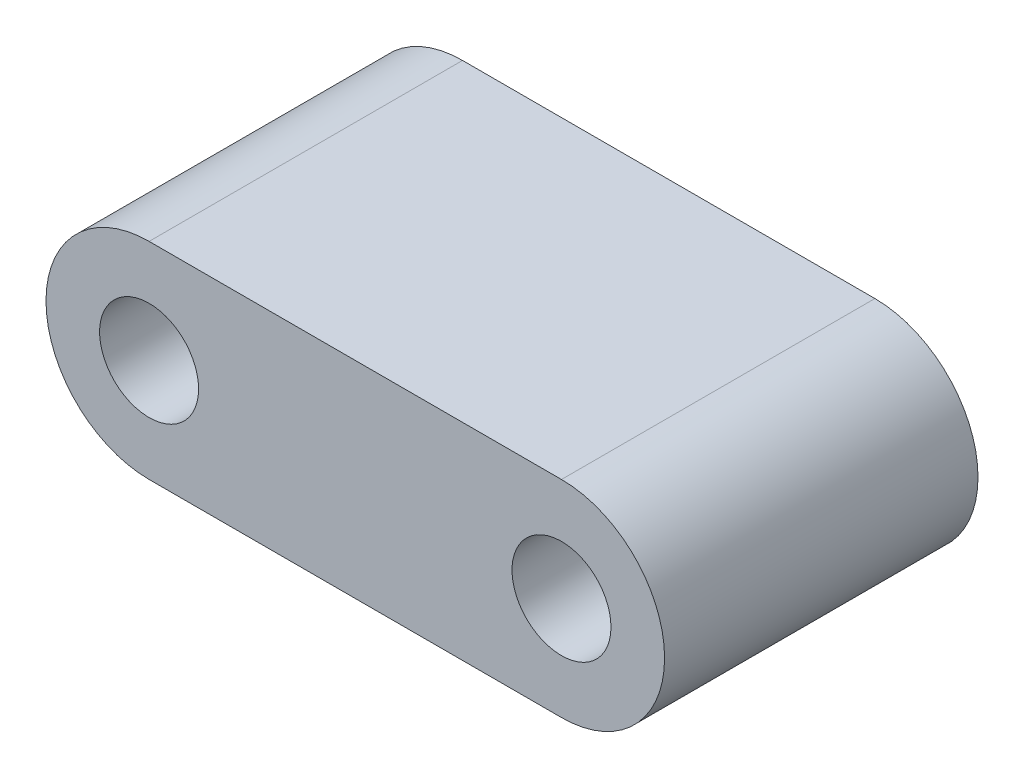
ISO-10303-21;
HEADER;
FILE_DESCRIPTION(('STEP AP214'),'2;1');
FILE_NAME('part.step','',(''),(''),'','','');
FILE_SCHEMA(('AUTOMOTIVE_DESIGN { 1 0 10303 214 1 1 1 1 }'));
ENDSEC;
DATA;
#1=APPLICATION_CONTEXT('core data for automotive mechanical design processes');
#2=APPLICATION_PROTOCOL_DEFINITION('international standard','automotive_design',2000,#1);
#3=PRODUCT_CONTEXT('',#1,'mechanical');
#4=PRODUCT('Part','Part','',(#3));
#5=PRODUCT_RELATED_PRODUCT_CATEGORY('part','',(#4));
#6=PRODUCT_DEFINITION_FORMATION('','',#4);
#7=PRODUCT_DEFINITION_CONTEXT('part definition',#1,'design');
#8=PRODUCT_DEFINITION('design','',#6,#7);
#9=PRODUCT_DEFINITION_SHAPE('','',#8);
#10=(LENGTH_UNIT() NAMED_UNIT(*) SI_UNIT(.MILLI.,.METRE.));
#11=(NAMED_UNIT(*) PLANE_ANGLE_UNIT() SI_UNIT($,.RADIAN.));
#12=(NAMED_UNIT(*) SI_UNIT($,.STERADIAN.) SOLID_ANGLE_UNIT());
#13=UNCERTAINTY_MEASURE_WITH_UNIT(LENGTH_MEASURE(1.E-05),#10,'distance_accuracy_value','');
#14=(GEOMETRIC_REPRESENTATION_CONTEXT(3) GLOBAL_UNCERTAINTY_ASSIGNED_CONTEXT((#13)) GLOBAL_UNIT_ASSIGNED_CONTEXT((#10,
#11,#12)) REPRESENTATION_CONTEXT('',''));
#15=CARTESIAN_POINT('',(0.,0.,0.));
#16=DIRECTION('',(0.,0.,1.));
#17=DIRECTION('',(1.,0.,0.));
#18=AXIS2_PLACEMENT_3D('',#15,#16,#17);
#19=CARTESIAN_POINT('',(0.,0.,19.));
#20=DIRECTION('',(0.,0.,1.));
#21=DIRECTION('',(1.,0.,0.));
#22=AXIS2_PLACEMENT_3D('',#19,#20,#21);
#23=PLANE('',#22);
#24=CARTESIAN_POINT('',(0.,0.,19.));
#25=DIRECTION('',(0.,0.,1.));
#26=DIRECTION('',(1.,0.,0.));
#27=AXIS2_PLACEMENT_3D('',#24,#25,#26);
#28=CIRCLE('',#27,6.);
#29=CARTESIAN_POINT('',(6.,0.,19.));
#30=VERTEX_POINT('',#29);
#31=EDGE_CURVE('E100',#30,#30,#28,.T.);
#32=ORIENTED_EDGE('',*,*,#31,.F.);
#33=EDGE_LOOP('',(#32));
#34=FACE_BOUND('',#33,.T.);
#35=CARTESIAN_POINT('',(0.,0.,19.));
#36=DIRECTION('',(0.,0.,1.));
#37=DIRECTION('',(1.,0.,0.));
#38=AXIS2_PLACEMENT_3D('',#35,#36,#37);
#39=CIRCLE('',#38,12.5);
#40=CARTESIAN_POINT('',(0.,12.5,19.));
#41=VERTEX_POINT('',#40);
#42=CARTESIAN_POINT('',(0.,-12.5,19.));
#43=VERTEX_POINT('',#42);
#44=EDGE_CURVE('E85',#41,#43,#39,.T.);
#45=ORIENTED_EDGE('',*,*,#44,.T.);
#46=DIRECTION('',(1.,0.,0.));
#47=VECTOR('',#46,1.);
#48=CARTESIAN_POINT('',(0.,-12.5,19.));
#49=LINE('',#48,#47);
#50=CARTESIAN_POINT('',(50.,-12.5,19.));
#51=VERTEX_POINT('',#50);
#52=EDGE_CURVE('E80',#43,#51,#49,.T.);
#53=ORIENTED_EDGE('',*,*,#52,.T.);
#54=CARTESIAN_POINT('',(50.,0.,19.));
#55=DIRECTION('',(0.,0.,1.));
#56=DIRECTION('',(1.,0.,0.));
#57=AXIS2_PLACEMENT_3D('',#54,#55,#56);
#58=CIRCLE('',#57,12.5);
#59=CARTESIAN_POINT('',(50.,12.5,19.));
#60=VERTEX_POINT('',#59);
#61=EDGE_CURVE('E83',#51,#60,#58,.T.);
#62=ORIENTED_EDGE('',*,*,#61,.T.);
#63=DIRECTION('',(-1.,0.,0.));
#64=VECTOR('',#63,1.);
#65=CARTESIAN_POINT('',(0.,12.5,19.));
#66=LINE('',#65,#64);
#67=EDGE_CURVE('E50',#60,#41,#66,.T.);
#68=ORIENTED_EDGE('',*,*,#67,.T.);
#69=EDGE_LOOP('',(#45,#53,#62,#68));
#70=FACE_BOUND('',#69,.T.);
#71=CARTESIAN_POINT('',(50.,0.,19.));
#72=DIRECTION('',(0.,0.,1.));
#73=DIRECTION('',(1.,0.,0.));
#74=AXIS2_PLACEMENT_3D('',#71,#72,#73);
#75=CIRCLE('',#74,6.);
#76=CARTESIAN_POINT('',(56.,0.,19.));
#77=VERTEX_POINT('',#76);
#78=EDGE_CURVE('E115',#77,#77,#75,.T.);
#79=ORIENTED_EDGE('',*,*,#78,.F.);
#80=EDGE_LOOP('',(#79));
#81=FACE_BOUND('',#80,.T.);
#82=ADVANCED_FACE('F33',(#34,#70,#81),#23,.T.);
#83=CARTESIAN_POINT('',(0.,0.,-19.));
#84=DIRECTION('',(0.,0.,1.));
#85=DIRECTION('',(1.,0.,0.));
#86=AXIS2_PLACEMENT_3D('',#83,#84,#85);
#87=PLANE('',#86);
#88=CARTESIAN_POINT('',(0.,0.,-19.));
#89=DIRECTION('',(0.,0.,1.));
#90=DIRECTION('',(1.,0.,0.));
#91=AXIS2_PLACEMENT_3D('',#88,#89,#90);
#92=CIRCLE('',#91,12.5);
#93=CARTESIAN_POINT('',(0.,12.5,-19.));
#94=VERTEX_POINT('',#93);
#95=CARTESIAN_POINT('',(0.,-12.5,-19.));
#96=VERTEX_POINT('',#95);
#97=EDGE_CURVE('E97',#94,#96,#92,.T.);
#98=ORIENTED_EDGE('',*,*,#97,.F.);
#99=DIRECTION('',(-1.,0.,0.));
#100=VECTOR('',#99,1.);
#101=CARTESIAN_POINT('',(0.,12.5,-19.));
#102=LINE('',#101,#100);
#103=CARTESIAN_POINT('',(50.,12.5,-19.));
#104=VERTEX_POINT('',#103);
#105=EDGE_CURVE('E73',#104,#94,#102,.T.);
#106=ORIENTED_EDGE('',*,*,#105,.F.);
#107=CARTESIAN_POINT('',(50.,0.,-19.));
#108=DIRECTION('',(0.,0.,1.));
#109=DIRECTION('',(1.,0.,0.));
#110=AXIS2_PLACEMENT_3D('',#107,#108,#109);
#111=CIRCLE('',#110,12.5);
#112=CARTESIAN_POINT('',(50.,-12.5,-19.));
#113=VERTEX_POINT('',#112);
#114=EDGE_CURVE('E67',#113,#104,#111,.T.);
#115=ORIENTED_EDGE('',*,*,#114,.F.);
#116=DIRECTION('',(1.,0.,0.));
#117=VECTOR('',#116,1.);
#118=CARTESIAN_POINT('',(0.,-12.5,-19.));
#119=LINE('',#118,#117);
#120=EDGE_CURVE('E89',#96,#113,#119,.T.);
#121=ORIENTED_EDGE('',*,*,#120,.F.);
#122=EDGE_LOOP('',(#98,#106,#115,#121));
#123=FACE_BOUND('',#122,.T.);
#124=CARTESIAN_POINT('',(0.,0.,-19.));
#125=DIRECTION('',(0.,0.,1.));
#126=DIRECTION('',(1.,0.,0.));
#127=AXIS2_PLACEMENT_3D('',#124,#125,#126);
#128=CIRCLE('',#127,6.);
#129=CARTESIAN_POINT('',(6.,0.,-19.));
#130=VERTEX_POINT('',#129);
#131=EDGE_CURVE('E112',#130,#130,#128,.T.);
#132=ORIENTED_EDGE('',*,*,#131,.T.);
#133=EDGE_LOOP('',(#132));
#134=FACE_BOUND('',#133,.T.);
#135=CARTESIAN_POINT('',(50.,0.,-19.));
#136=DIRECTION('',(0.,0.,1.));
#137=DIRECTION('',(1.,0.,0.));
#138=AXIS2_PLACEMENT_3D('',#135,#136,#137);
#139=CIRCLE('',#138,6.);
#140=CARTESIAN_POINT('',(56.,0.,-19.));
#141=VERTEX_POINT('',#140);
#142=EDGE_CURVE('E118',#141,#141,#139,.T.);
#143=ORIENTED_EDGE('',*,*,#142,.T.);
#144=EDGE_LOOP('',(#143));
#145=FACE_BOUND('',#144,.T.);
#146=ADVANCED_FACE('F108',(#123,#134,#145),#87,.F.);
#147=CARTESIAN_POINT('',(0.,0.,19.));
#148=DIRECTION('',(0.,0.,-1.));
#149=DIRECTION('',(-1.,0.,0.));
#150=AXIS2_PLACEMENT_3D('',#147,#148,#149);
#151=CYLINDRICAL_SURFACE('',#150,12.5);
#152=ORIENTED_EDGE('',*,*,#97,.T.);
#153=DIRECTION('',(0.,0.,-1.));
#154=VECTOR('',#153,1.);
#155=CARTESIAN_POINT('',(0.,-12.5,19.));
#156=LINE('',#155,#154);
#157=EDGE_CURVE('E11',#43,#96,#156,.T.);
#158=ORIENTED_EDGE('',*,*,#157,.F.);
#159=ORIENTED_EDGE('',*,*,#44,.F.);
#160=DIRECTION('',(0.,0.,-1.));
#161=VECTOR('',#160,1.);
#162=CARTESIAN_POINT('',(0.,12.5,19.));
#163=LINE('',#162,#161);
#164=EDGE_CURVE('E93',#41,#94,#163,.T.);
#165=ORIENTED_EDGE('',*,*,#164,.T.);
#166=EDGE_LOOP('',(#152,#158,#159,#165));
#167=FACE_BOUND('',#166,.T.);
#168=ADVANCED_FACE('F35',(#167),#151,.T.);
#169=CARTESIAN_POINT('',(0.,-12.5,19.));
#170=DIRECTION('',(0.,1.,0.));
#171=DIRECTION('',(0.,0.,1.));
#172=AXIS2_PLACEMENT_3D('',#169,#170,#171);
#173=PLANE('',#172);
#174=CARTESIAN_POINT('',(25.,-12.5,0.));
#175=DIRECTION('',(0.,-1.,0.));
#176=DIRECTION('',(0.,0.,-1.));
#177=AXIS2_PLACEMENT_3D('',#174,#175,#176);
#178=CIRCLE('',#177,6.);
#179=CARTESIAN_POINT('',(25.,-12.5,-6.));
#180=VERTEX_POINT('',#179);
#181=EDGE_CURVE('E124',#180,#180,#178,.T.);
#182=ORIENTED_EDGE('',*,*,#181,.F.);
#183=EDGE_LOOP('',(#182));
#184=FACE_BOUND('',#183,.T.);
#185=ORIENTED_EDGE('',*,*,#120,.T.);
#186=DIRECTION('',(0.,0.,-1.));
#187=VECTOR('',#186,1.);
#188=CARTESIAN_POINT('',(50.,-12.5,19.));
#189=LINE('',#188,#187);
#190=EDGE_CURVE('E42',#51,#113,#189,.T.);
#191=ORIENTED_EDGE('',*,*,#190,.F.);
#192=ORIENTED_EDGE('',*,*,#52,.F.);
#193=ORIENTED_EDGE('',*,*,#157,.T.);
#194=EDGE_LOOP('',(#185,#191,#192,#193));
#195=FACE_BOUND('',#194,.T.);
#196=ADVANCED_FACE('F88',(#184,#195),#173,.F.);
#197=CARTESIAN_POINT('',(50.,0.,19.));
#198=DIRECTION('',(0.,0.,-1.));
#199=DIRECTION('',(-1.,0.,0.));
#200=AXIS2_PLACEMENT_3D('',#197,#198,#199);
#201=CYLINDRICAL_SURFACE('',#200,12.5);
#202=ORIENTED_EDGE('',*,*,#114,.T.);
#203=DIRECTION('',(0.,0.,-1.));
#204=VECTOR('',#203,1.);
#205=CARTESIAN_POINT('',(50.,12.5,19.));
#206=LINE('',#205,#204);
#207=EDGE_CURVE('E90',#60,#104,#206,.T.);
#208=ORIENTED_EDGE('',*,*,#207,.F.);
#209=ORIENTED_EDGE('',*,*,#61,.F.);
#210=ORIENTED_EDGE('',*,*,#190,.T.);
#211=EDGE_LOOP('',(#202,#208,#209,#210));
#212=FACE_BOUND('',#211,.T.);
#213=ADVANCED_FACE('F91',(#212),#201,.T.);
#214=CARTESIAN_POINT('',(0.,12.5,19.));
#215=DIRECTION('',(0.,-1.,0.));
#216=DIRECTION('',(0.,0.,-1.));
#217=AXIS2_PLACEMENT_3D('',#214,#215,#216);
#218=PLANE('',#217);
#219=ORIENTED_EDGE('',*,*,#105,.T.);
#220=ORIENTED_EDGE('',*,*,#164,.F.);
#221=ORIENTED_EDGE('',*,*,#67,.F.);
#222=ORIENTED_EDGE('',*,*,#207,.T.);
#223=EDGE_LOOP('',(#219,#220,#221,#222));
#224=FACE_BOUND('',#223,.T.);
#225=ADVANCED_FACE('F105',(#224),#218,.F.);
#226=CARTESIAN_POINT('',(0.,0.,19.));
#227=DIRECTION('',(0.,0.,-1.));
#228=DIRECTION('',(-1.,0.,0.));
#229=AXIS2_PLACEMENT_3D('',#226,#227,#228);
#230=CYLINDRICAL_SURFACE('',#229,6.);
#231=ORIENTED_EDGE('',*,*,#31,.T.);
#232=EDGE_LOOP('',(#231));
#233=FACE_BOUND('',#232,.T.);
#234=ORIENTED_EDGE('',*,*,#131,.F.);
#235=EDGE_LOOP('',(#234));
#236=FACE_BOUND('',#235,.T.);
#237=ADVANCED_FACE('F154',(#233,#236),#230,.F.);
#238=CARTESIAN_POINT('',(50.,0.,19.));
#239=DIRECTION('',(0.,0.,-1.));
#240=DIRECTION('',(-1.,0.,0.));
#241=AXIS2_PLACEMENT_3D('',#238,#239,#240);
#242=CYLINDRICAL_SURFACE('',#241,6.);
#243=ORIENTED_EDGE('',*,*,#78,.T.);
#244=EDGE_LOOP('',(#243));
#245=FACE_BOUND('',#244,.T.);
#246=ORIENTED_EDGE('',*,*,#142,.F.);
#247=EDGE_LOOP('',(#246));
#248=FACE_BOUND('',#247,.T.);
#249=ADVANCED_FACE('F135',(#245,#248),#242,.F.);
#250=CARTESIAN_POINT('',(25.,0.,0.));
#251=DIRECTION('',(0.,-1.,0.));
#252=DIRECTION('',(0.,0.,-1.));
#253=AXIS2_PLACEMENT_3D('',#250,#251,#252);
#254=CYLINDRICAL_SURFACE('',#253,6.);
#255=CARTESIAN_POINT('',(25.,0.,0.));
#256=DIRECTION('',(0.,-1.,0.));
#257=DIRECTION('',(0.,0.,-1.));
#258=AXIS2_PLACEMENT_3D('',#255,#256,#257);
#259=CIRCLE('',#258,6.);
#260=CARTESIAN_POINT('',(25.,0.,-6.));
#261=VERTEX_POINT('',#260);
#262=EDGE_CURVE('E121',#261,#261,#259,.T.);
#263=ORIENTED_EDGE('',*,*,#262,.F.);
#264=EDGE_LOOP('',(#263));
#265=FACE_BOUND('',#264,.T.);
#266=ORIENTED_EDGE('',*,*,#181,.T.);
#267=EDGE_LOOP('',(#266));
#268=FACE_BOUND('',#267,.T.);
#269=ADVANCED_FACE('F132',(#265,#268),#254,.F.);
#270=CARTESIAN_POINT('',(25.,0.,0.));
#271=DIRECTION('',(0.,-1.,0.));
#272=DIRECTION('',(0.,0.,-1.));
#273=AXIS2_PLACEMENT_3D('',#270,#271,#272);
#274=PLANE('',#273);
#275=ORIENTED_EDGE('',*,*,#262,.T.);
#276=EDGE_LOOP('',(#275));
#277=FACE_BOUND('',#276,.T.);
#278=ADVANCED_FACE('F130',(#277),#274,.T.);
#279=CLOSED_SHELL('',(#82,#146,#168,#196,#213,#225,#237,#249,#269,#278));
#280=MANIFOLD_SOLID_BREP('B2',#279);
#281=ADVANCED_BREP_SHAPE_REPRESENTATION('',(#18,#280),#14);
#282=SHAPE_DEFINITION_REPRESENTATION(#9,#281);
ENDSEC;
END-ISO-10303-21;
